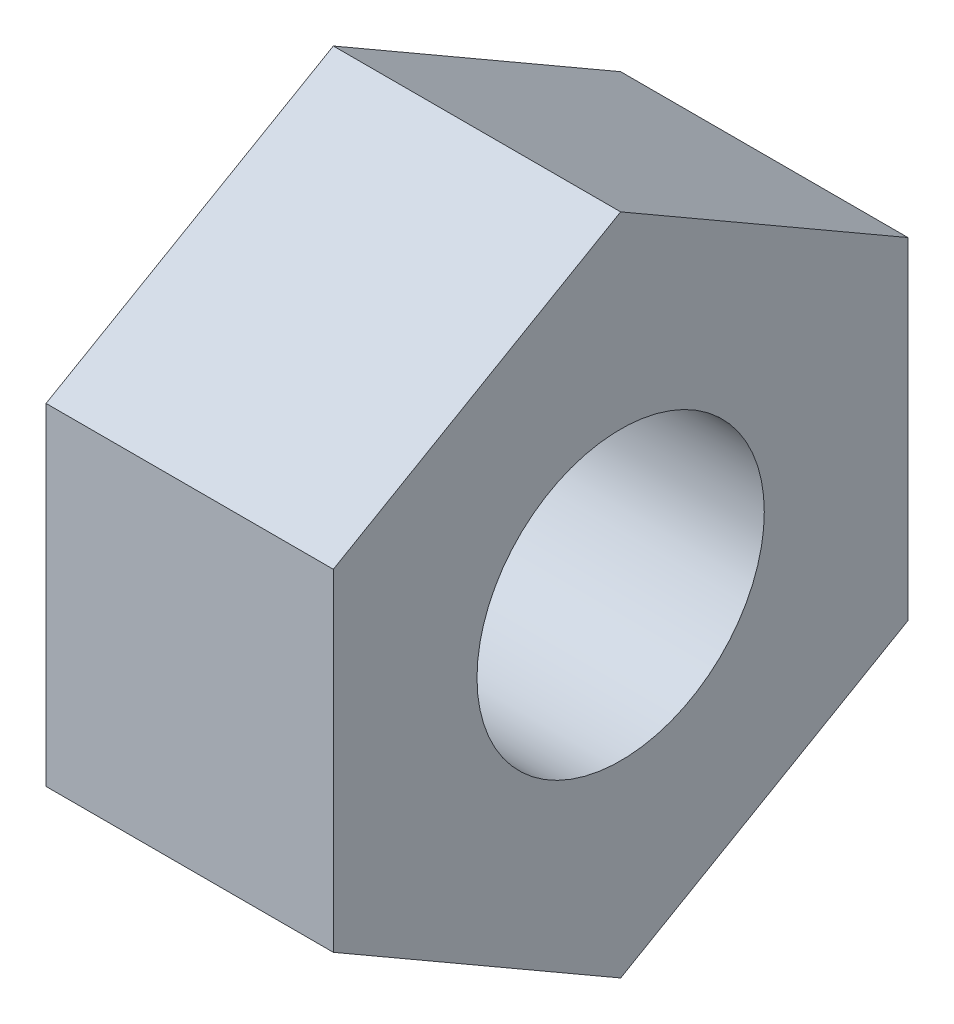
ISO-10303-21;
HEADER;
FILE_DESCRIPTION(('STEP AP214'),'2;1');
FILE_NAME('part.step','',(''),(''),'','','');
FILE_SCHEMA(('AUTOMOTIVE_DESIGN { 1 0 10303 214 1 1 1 1 }'));
ENDSEC;
DATA;
#1=APPLICATION_CONTEXT('core data for automotive mechanical design processes');
#2=APPLICATION_PROTOCOL_DEFINITION('international standard','automotive_design',2000,#1);
#3=PRODUCT_CONTEXT('',#1,'mechanical');
#4=PRODUCT('Part','Part','',(#3));
#5=PRODUCT_RELATED_PRODUCT_CATEGORY('part','',(#4));
#6=PRODUCT_DEFINITION_FORMATION('','',#4);
#7=PRODUCT_DEFINITION_CONTEXT('part definition',#1,'design');
#8=PRODUCT_DEFINITION('design','',#6,#7);
#9=PRODUCT_DEFINITION_SHAPE('','',#8);
#10=(LENGTH_UNIT() NAMED_UNIT(*) SI_UNIT(.MILLI.,.METRE.));
#11=(NAMED_UNIT(*) PLANE_ANGLE_UNIT() SI_UNIT($,.RADIAN.));
#12=(NAMED_UNIT(*) SI_UNIT($,.STERADIAN.) SOLID_ANGLE_UNIT());
#13=UNCERTAINTY_MEASURE_WITH_UNIT(LENGTH_MEASURE(1.E-05),#10,'distance_accuracy_value','');
#14=(GEOMETRIC_REPRESENTATION_CONTEXT(3) GLOBAL_UNCERTAINTY_ASSIGNED_CONTEXT((#13)) GLOBAL_UNIT_ASSIGNED_CONTEXT((#10,
#11,#12)) REPRESENTATION_CONTEXT('',''));
#15=CARTESIAN_POINT('',(0.,0.,0.));
#16=DIRECTION('',(0.,0.,1.));
#17=DIRECTION('',(1.,0.,0.));
#18=AXIS2_PLACEMENT_3D('',#15,#16,#17);
#19=CARTESIAN_POINT('',(2.,0.,0.));
#20=DIRECTION('',(1.,0.,0.));
#21=DIRECTION('',(0.,0.,-1.));
#22=AXIS2_PLACEMENT_3D('',#19,#20,#21);
#23=PLANE('',#22);
#24=DIRECTION('',(0.,0.499999999999995,0.866025403784442));
#25=VECTOR('',#24,1.);
#26=CARTESIAN_POINT('',(2.,1.15470053837928,-1.99999999999999));
#27=LINE('',#26,#25);
#28=CARTESIAN_POINT('',(2.,1.15470053837928,-1.99999999999999));
#29=VERTEX_POINT('',#28);
#30=CARTESIAN_POINT('',(2.,2.3094010767585,0.));
#31=VERTEX_POINT('',#30);
#32=EDGE_CURVE('E132',#29,#31,#27,.T.);
#33=ORIENTED_EDGE('',*,*,#32,.T.);
#34=DIRECTION('',(0.,-0.500000000000001,0.866025403784438));
#35=VECTOR('',#34,1.);
#36=CARTESIAN_POINT('',(2.,2.3094010767585,0.));
#37=LINE('',#36,#35);
#38=CARTESIAN_POINT('',(2.,1.15470053837925,2.));
#39=VERTEX_POINT('',#38);
#40=EDGE_CURVE('E90',#31,#39,#37,.T.);
#41=ORIENTED_EDGE('',*,*,#40,.T.);
#42=DIRECTION('',(0.,-1.,0.));
#43=VECTOR('',#42,1.);
#44=CARTESIAN_POINT('',(2.,1.15470053837925,2.));
#45=LINE('',#44,#43);
#46=CARTESIAN_POINT('',(2.,-1.15470053837926,2.));
#47=VERTEX_POINT('',#46);
#48=EDGE_CURVE('E103',#39,#47,#45,.T.);
#49=ORIENTED_EDGE('',*,*,#48,.T.);
#50=DIRECTION('',(0.,-0.499999999999995,-0.866025403784442));
#51=VECTOR('',#50,1.);
#52=CARTESIAN_POINT('',(2.,-1.15470053837926,2.));
#53=LINE('',#52,#51);
#54=CARTESIAN_POINT('',(2.,-2.3094010767585,0.));
#55=VERTEX_POINT('',#54);
#56=EDGE_CURVE('E97',#47,#55,#53,.T.);
#57=ORIENTED_EDGE('',*,*,#56,.T.);
#58=DIRECTION('',(0.,0.500000000000007,-0.866025403784435));
#59=VECTOR('',#58,1.);
#60=CARTESIAN_POINT('',(2.,-2.3094010767585,0.));
#61=LINE('',#60,#59);
#62=CARTESIAN_POINT('',(2.,-1.15470053837923,-2.00000000000001));
#63=VERTEX_POINT('',#62);
#64=EDGE_CURVE('E101',#55,#63,#61,.T.);
#65=ORIENTED_EDGE('',*,*,#64,.T.);
#66=DIRECTION('',(0.,1.,0.));
#67=VECTOR('',#66,1.);
#68=CARTESIAN_POINT('',(2.,-1.15470053837923,-2.00000000000001));
#69=LINE('',#68,#67);
#70=EDGE_CURVE('E53',#63,#29,#69,.T.);
#71=ORIENTED_EDGE('',*,*,#70,.T.);
#72=EDGE_LOOP('',(#33,#41,#49,#57,#65,#71));
#73=FACE_BOUND('',#72,.T.);
#74=CARTESIAN_POINT('',(2.,0.,0.));
#75=DIRECTION('',(1.,0.,0.));
#76=DIRECTION('',(0.,0.,-1.));
#77=AXIS2_PLACEMENT_3D('',#74,#75,#76);
#78=CIRCLE('',#77,1.);
#79=CARTESIAN_POINT('',(2.,0.,-1.));
#80=VERTEX_POINT('',#79);
#81=EDGE_CURVE('E125',#80,#80,#78,.T.);
#82=ORIENTED_EDGE('',*,*,#81,.F.);
#83=EDGE_LOOP('',(#82));
#84=FACE_BOUND('',#83,.T.);
#85=ADVANCED_FACE('F36',(#73,#84),#23,.T.);
#86=CARTESIAN_POINT('',(0.,0.,0.));
#87=DIRECTION('',(1.,0.,0.));
#88=DIRECTION('',(0.,0.,-1.));
#89=AXIS2_PLACEMENT_3D('',#86,#87,#88);
#90=PLANE('',#89);
#91=DIRECTION('',(0.,0.499999999999995,0.866025403784442));
#92=VECTOR('',#91,1.);
#93=CARTESIAN_POINT('',(0.,1.15470053837928,-1.99999999999999));
#94=LINE('',#93,#92);
#95=CARTESIAN_POINT('',(0.,1.15470053837928,-1.99999999999999));
#96=VERTEX_POINT('',#95);
#97=CARTESIAN_POINT('',(0.,2.3094010767585,0.));
#98=VERTEX_POINT('',#97);
#99=EDGE_CURVE('E121',#96,#98,#94,.T.);
#100=ORIENTED_EDGE('',*,*,#99,.F.);
#101=DIRECTION('',(0.,1.,0.));
#102=VECTOR('',#101,1.);
#103=CARTESIAN_POINT('',(0.,-1.15470053837923,-2.00000000000001));
#104=LINE('',#103,#102);
#105=CARTESIAN_POINT('',(0.,-1.15470053837923,-2.00000000000001));
#106=VERTEX_POINT('',#105);
#107=EDGE_CURVE('E82',#106,#96,#104,.T.);
#108=ORIENTED_EDGE('',*,*,#107,.F.);
#109=DIRECTION('',(0.,0.500000000000007,-0.866025403784435));
#110=VECTOR('',#109,1.);
#111=CARTESIAN_POINT('',(0.,-2.3094010767585,0.));
#112=LINE('',#111,#110);
#113=CARTESIAN_POINT('',(0.,-2.3094010767585,0.));
#114=VERTEX_POINT('',#113);
#115=EDGE_CURVE('E76',#114,#106,#112,.T.);
#116=ORIENTED_EDGE('',*,*,#115,.F.);
#117=DIRECTION('',(0.,-0.499999999999995,-0.866025403784442));
#118=VECTOR('',#117,1.);
#119=CARTESIAN_POINT('',(0.,-1.15470053837926,2.));
#120=LINE('',#119,#118);
#121=CARTESIAN_POINT('',(0.,-1.15470053837926,2.));
#122=VERTEX_POINT('',#121);
#123=EDGE_CURVE('E111',#122,#114,#120,.T.);
#124=ORIENTED_EDGE('',*,*,#123,.F.);
#125=DIRECTION('',(0.,-1.,0.));
#126=VECTOR('',#125,1.);
#127=CARTESIAN_POINT('',(0.,1.15470053837925,2.));
#128=LINE('',#127,#126);
#129=CARTESIAN_POINT('',(0.,1.15470053837925,2.));
#130=VERTEX_POINT('',#129);
#131=EDGE_CURVE('E127',#130,#122,#128,.T.);
#132=ORIENTED_EDGE('',*,*,#131,.F.);
#133=DIRECTION('',(0.,-0.500000000000001,0.866025403784438));
#134=VECTOR('',#133,1.);
#135=CARTESIAN_POINT('',(0.,2.3094010767585,0.));
#136=LINE('',#135,#134);
#137=EDGE_CURVE('E124',#98,#130,#136,.T.);
#138=ORIENTED_EDGE('',*,*,#137,.F.);
#139=EDGE_LOOP('',(#100,#108,#116,#124,#132,#138));
#140=FACE_BOUND('',#139,.T.);
#141=CARTESIAN_POINT('',(0.,0.,0.));
#142=DIRECTION('',(1.,0.,0.));
#143=DIRECTION('',(0.,0.,-1.));
#144=AXIS2_PLACEMENT_3D('',#141,#142,#143);
#145=CIRCLE('',#144,1.);
#146=CARTESIAN_POINT('',(0.,0.,-1.));
#147=VERTEX_POINT('',#146);
#148=EDGE_CURVE('E225',#147,#147,#145,.T.);
#149=ORIENTED_EDGE('',*,*,#148,.T.);
#150=EDGE_LOOP('',(#149));
#151=FACE_BOUND('',#150,.T.);
#152=ADVANCED_FACE('F141',(#140,#151),#90,.F.);
#153=CARTESIAN_POINT('',(2.,1.15470053837928,-1.99999999999999));
#154=DIRECTION('',(0.,-0.866025403784442,0.499999999999995));
#155=DIRECTION('',(0.,-0.499999999999995,-0.866025403784442));
#156=AXIS2_PLACEMENT_3D('',#153,#154,#155);
#157=PLANE('',#156);
#158=ORIENTED_EDGE('',*,*,#99,.T.);
#159=DIRECTION('',(-1.,0.,0.));
#160=VECTOR('',#159,1.);
#161=CARTESIAN_POINT('',(2.,2.3094010767585,0.));
#162=LINE('',#161,#160);
#163=EDGE_CURVE('E11',#31,#98,#162,.T.);
#164=ORIENTED_EDGE('',*,*,#163,.F.);
#165=ORIENTED_EDGE('',*,*,#32,.F.);
#166=DIRECTION('',(-1.,0.,0.));
#167=VECTOR('',#166,1.);
#168=CARTESIAN_POINT('',(2.,1.15470053837928,-1.99999999999999));
#169=LINE('',#168,#167);
#170=EDGE_CURVE('E117',#29,#96,#169,.T.);
#171=ORIENTED_EDGE('',*,*,#170,.T.);
#172=EDGE_LOOP('',(#158,#164,#165,#171));
#173=FACE_BOUND('',#172,.T.);
#174=ADVANCED_FACE('F38',(#173),#157,.F.);
#175=CARTESIAN_POINT('',(2.,2.3094010767585,0.));
#176=DIRECTION('',(0.,-0.866025403784438,-0.500000000000001));
#177=DIRECTION('',(0.,0.500000000000001,-0.866025403784438));
#178=AXIS2_PLACEMENT_3D('',#175,#176,#177);
#179=PLANE('',#178);
#180=ORIENTED_EDGE('',*,*,#137,.T.);
#181=DIRECTION('',(-1.,0.,0.));
#182=VECTOR('',#181,1.);
#183=CARTESIAN_POINT('',(2.,1.15470053837925,2.));
#184=LINE('',#183,#182);
#185=EDGE_CURVE('E45',#39,#130,#184,.T.);
#186=ORIENTED_EDGE('',*,*,#185,.F.);
#187=ORIENTED_EDGE('',*,*,#40,.F.);
#188=ORIENTED_EDGE('',*,*,#163,.T.);
#189=EDGE_LOOP('',(#180,#186,#187,#188));
#190=FACE_BOUND('',#189,.T.);
#191=ADVANCED_FACE('F166',(#190),#179,.F.);
#192=CARTESIAN_POINT('',(2.,1.15470053837925,2.));
#193=DIRECTION('',(0.,0.,-1.));
#194=DIRECTION('',(0.,1.,0.));
#195=AXIS2_PLACEMENT_3D('',#192,#193,#194);
#196=PLANE('',#195);
#197=ORIENTED_EDGE('',*,*,#131,.T.);
#198=DIRECTION('',(-1.,0.,0.));
#199=VECTOR('',#198,1.);
#200=CARTESIAN_POINT('',(2.,-1.15470053837926,2.));
#201=LINE('',#200,#199);
#202=EDGE_CURVE('E112',#47,#122,#201,.T.);
#203=ORIENTED_EDGE('',*,*,#202,.F.);
#204=ORIENTED_EDGE('',*,*,#48,.F.);
#205=ORIENTED_EDGE('',*,*,#185,.T.);
#206=EDGE_LOOP('',(#197,#203,#204,#205));
#207=FACE_BOUND('',#206,.T.);
#208=ADVANCED_FACE('F138',(#207),#196,.F.);
#209=CARTESIAN_POINT('',(2.,-1.15470053837926,2.));
#210=DIRECTION('',(0.,0.866025403784442,-0.499999999999995));
#211=DIRECTION('',(0.,0.499999999999995,0.866025403784442));
#212=AXIS2_PLACEMENT_3D('',#209,#210,#211);
#213=PLANE('',#212);
#214=ORIENTED_EDGE('',*,*,#123,.T.);
#215=DIRECTION('',(-1.,0.,0.));
#216=VECTOR('',#215,1.);
#217=CARTESIAN_POINT('',(2.,-2.3094010767585,0.));
#218=LINE('',#217,#216);
#219=EDGE_CURVE('E108',#55,#114,#218,.T.);
#220=ORIENTED_EDGE('',*,*,#219,.F.);
#221=ORIENTED_EDGE('',*,*,#56,.F.);
#222=ORIENTED_EDGE('',*,*,#202,.T.);
#223=EDGE_LOOP('',(#214,#220,#221,#222));
#224=FACE_BOUND('',#223,.T.);
#225=ADVANCED_FACE('F109',(#224),#213,.F.);
#226=CARTESIAN_POINT('',(2.,-2.3094010767585,0.));
#227=DIRECTION('',(0.,0.866025403784435,0.500000000000007));
#228=DIRECTION('',(0.,-0.500000000000007,0.866025403784435));
#229=AXIS2_PLACEMENT_3D('',#226,#227,#228);
#230=PLANE('',#229);
#231=ORIENTED_EDGE('',*,*,#115,.T.);
#232=DIRECTION('',(-1.,0.,0.));
#233=VECTOR('',#232,1.);
#234=CARTESIAN_POINT('',(2.,-1.15470053837923,-2.00000000000001));
#235=LINE('',#234,#233);
#236=EDGE_CURVE('E113',#63,#106,#235,.T.);
#237=ORIENTED_EDGE('',*,*,#236,.F.);
#238=ORIENTED_EDGE('',*,*,#64,.F.);
#239=ORIENTED_EDGE('',*,*,#219,.T.);
#240=EDGE_LOOP('',(#231,#237,#238,#239));
#241=FACE_BOUND('',#240,.T.);
#242=ADVANCED_FACE('F115',(#241),#230,.F.);
#243=CARTESIAN_POINT('',(2.,-1.15470053837923,-2.00000000000001));
#244=DIRECTION('',(0.,0.,1.));
#245=DIRECTION('',(0.,-1.,0.));
#246=AXIS2_PLACEMENT_3D('',#243,#244,#245);
#247=PLANE('',#246);
#248=ORIENTED_EDGE('',*,*,#107,.T.);
#249=ORIENTED_EDGE('',*,*,#170,.F.);
#250=ORIENTED_EDGE('',*,*,#70,.F.);
#251=ORIENTED_EDGE('',*,*,#236,.T.);
#252=EDGE_LOOP('',(#248,#249,#250,#251));
#253=FACE_BOUND('',#252,.T.);
#254=ADVANCED_FACE('F146',(#253),#247,.F.);
#255=CARTESIAN_POINT('',(2.,0.,0.));
#256=DIRECTION('',(-1.,0.,0.));
#257=DIRECTION('',(0.,0.,1.));
#258=AXIS2_PLACEMENT_3D('',#255,#256,#257);
#259=CYLINDRICAL_SURFACE('',#258,1.);
#260=ORIENTED_EDGE('',*,*,#81,.T.);
#261=EDGE_LOOP('',(#260));
#262=FACE_BOUND('',#261,.T.);
#263=ORIENTED_EDGE('',*,*,#148,.F.);
#264=EDGE_LOOP('',(#263));
#265=FACE_BOUND('',#264,.T.);
#266=ADVANCED_FACE('F148',(#262,#265),#259,.F.);
#267=CLOSED_SHELL('',(#85,#152,#174,#191,#208,#225,#242,#254,#266));
#268=MANIFOLD_SOLID_BREP('B2',#267);
#269=ADVANCED_BREP_SHAPE_REPRESENTATION('',(#18,#268),#14);
#270=SHAPE_DEFINITION_REPRESENTATION(#9,#269);
ENDSEC;
END-ISO-10303-21;
